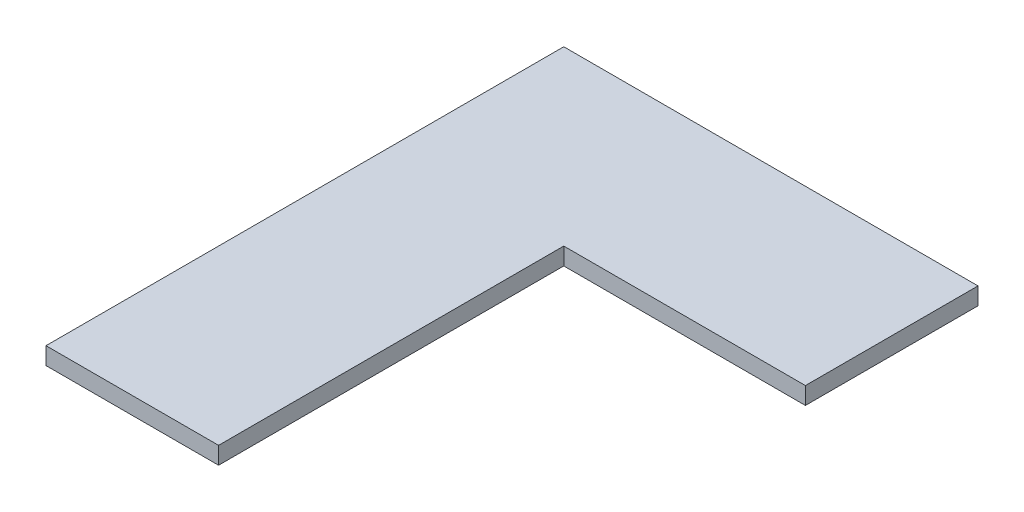
ISO-10303-21;
HEADER;
FILE_DESCRIPTION(('STEP AP214'),'2;1');
FILE_NAME('part.step','',(''),(''),'','','');
FILE_SCHEMA(('AUTOMOTIVE_DESIGN { 1 0 10303 214 1 1 1 1 }'));
ENDSEC;
DATA;
#1=APPLICATION_CONTEXT('core data for automotive mechanical design processes');
#2=APPLICATION_PROTOCOL_DEFINITION('international standard','automotive_design',2000,#1);
#3=PRODUCT_CONTEXT('',#1,'mechanical');
#4=PRODUCT('Part','Part','',(#3));
#5=PRODUCT_RELATED_PRODUCT_CATEGORY('part','',(#4));
#6=PRODUCT_DEFINITION_FORMATION('','',#4);
#7=PRODUCT_DEFINITION_CONTEXT('part definition',#1,'design');
#8=PRODUCT_DEFINITION('design','',#6,#7);
#9=PRODUCT_DEFINITION_SHAPE('','',#8);
#10=(LENGTH_UNIT() NAMED_UNIT(*) SI_UNIT(.MILLI.,.METRE.));
#11=(NAMED_UNIT(*) PLANE_ANGLE_UNIT() SI_UNIT($,.RADIAN.));
#12=(NAMED_UNIT(*) SI_UNIT($,.STERADIAN.) SOLID_ANGLE_UNIT());
#13=UNCERTAINTY_MEASURE_WITH_UNIT(LENGTH_MEASURE(1.E-05),#10,'distance_accuracy_value','');
#14=(GEOMETRIC_REPRESENTATION_CONTEXT(3) GLOBAL_UNCERTAINTY_ASSIGNED_CONTEXT((#13)) GLOBAL_UNIT_ASSIGNED_CONTEXT((#10,
#11,#12)) REPRESENTATION_CONTEXT('',''));
#15=CARTESIAN_POINT('',(0.,0.,0.));
#16=DIRECTION('',(0.,0.,1.));
#17=DIRECTION('',(1.,0.,0.));
#18=AXIS2_PLACEMENT_3D('',#15,#16,#17);
#19=CARTESIAN_POINT('',(0.,1.,0.));
#20=DIRECTION('',(1.,0.,0.));
#21=DIRECTION('',(0.,0.,-1.));
#22=AXIS2_PLACEMENT_3D('',#19,#20,#21);
#23=PLANE('',#22);
#24=DIRECTION('',(0.,0.,1.));
#25=VECTOR('',#24,1.);
#26=CARTESIAN_POINT('',(0.,0.,0.));
#27=LINE('',#26,#25);
#28=CARTESIAN_POINT('',(0.,0.,0.));
#29=VERTEX_POINT('',#28);
#30=CARTESIAN_POINT('',(0.,0.,30.));
#31=VERTEX_POINT('',#30);
#32=EDGE_CURVE('E123',#29,#31,#27,.T.);
#33=ORIENTED_EDGE('',*,*,#32,.T.);
#34=DIRECTION('',(0.,-1.,0.));
#35=VECTOR('',#34,1.);
#36=CARTESIAN_POINT('',(0.,1.,30.));
#37=LINE('',#36,#35);
#38=CARTESIAN_POINT('',(0.,1.,30.));
#39=VERTEX_POINT('',#38);
#40=EDGE_CURVE('E11',#39,#31,#37,.T.);
#41=ORIENTED_EDGE('',*,*,#40,.F.);
#42=DIRECTION('',(0.,0.,1.));
#43=VECTOR('',#42,1.);
#44=CARTESIAN_POINT('',(0.,1.,0.));
#45=LINE('',#44,#43);
#46=CARTESIAN_POINT('',(0.,1.,0.));
#47=VERTEX_POINT('',#46);
#48=EDGE_CURVE('E137',#47,#39,#45,.T.);
#49=ORIENTED_EDGE('',*,*,#48,.F.);
#50=DIRECTION('',(0.,-1.,0.));
#51=VECTOR('',#50,1.);
#52=CARTESIAN_POINT('',(0.,1.,0.));
#53=LINE('',#52,#51);
#54=EDGE_CURVE('E55',#47,#29,#53,.T.);
#55=ORIENTED_EDGE('',*,*,#54,.T.);
#56=EDGE_LOOP('',(#33,#41,#49,#55));
#57=FACE_BOUND('',#56,.T.);
#58=ADVANCED_FACE('F39',(#57),#23,.F.);
#59=CARTESIAN_POINT('',(0.,1.,30.));
#60=DIRECTION('',(0.,0.,-1.));
#61=DIRECTION('',(-1.,0.,0.));
#62=AXIS2_PLACEMENT_3D('',#59,#60,#61);
#63=PLANE('',#62);
#64=DIRECTION('',(1.,0.,0.));
#65=VECTOR('',#64,1.);
#66=CARTESIAN_POINT('',(0.,0.,30.));
#67=LINE('',#66,#65);
#68=CARTESIAN_POINT('',(10.,0.,30.));
#69=VERTEX_POINT('',#68);
#70=EDGE_CURVE('E125',#31,#69,#67,.T.);
#71=ORIENTED_EDGE('',*,*,#70,.T.);
#72=DIRECTION('',(0.,-1.,0.));
#73=VECTOR('',#72,1.);
#74=CARTESIAN_POINT('',(10.,1.,30.));
#75=LINE('',#74,#73);
#76=CARTESIAN_POINT('',(10.,1.,30.));
#77=VERTEX_POINT('',#76);
#78=EDGE_CURVE('E47',#77,#69,#75,.T.);
#79=ORIENTED_EDGE('',*,*,#78,.F.);
#80=DIRECTION('',(1.,0.,0.));
#81=VECTOR('',#80,1.);
#82=CARTESIAN_POINT('',(0.,1.,30.));
#83=LINE('',#82,#81);
#84=EDGE_CURVE('E87',#39,#77,#83,.T.);
#85=ORIENTED_EDGE('',*,*,#84,.F.);
#86=ORIENTED_EDGE('',*,*,#40,.T.);
#87=EDGE_LOOP('',(#71,#79,#85,#86));
#88=FACE_BOUND('',#87,.T.);
#89=ADVANCED_FACE('F143',(#88),#63,.F.);
#90=CARTESIAN_POINT('',(10.,1.,0.));
#91=DIRECTION('',(1.,0.,0.));
#92=DIRECTION('',(0.,0.,-1.));
#93=AXIS2_PLACEMENT_3D('',#90,#91,#92);
#94=PLANE('',#93);
#95=DIRECTION('',(0.,0.,1.));
#96=VECTOR('',#95,1.);
#97=CARTESIAN_POINT('',(10.,0.,0.));
#98=LINE('',#97,#96);
#99=CARTESIAN_POINT('',(10.,0.,10.));
#100=VERTEX_POINT('',#99);
#101=EDGE_CURVE('E128',#100,#69,#98,.T.);
#102=ORIENTED_EDGE('',*,*,#101,.F.);
#103=DIRECTION('',(0.,-1.,0.));
#104=VECTOR('',#103,1.);
#105=CARTESIAN_POINT('',(10.,1.,10.));
#106=LINE('',#105,#104);
#107=CARTESIAN_POINT('',(10.,1.,10.));
#108=VERTEX_POINT('',#107);
#109=EDGE_CURVE('E106',#108,#100,#106,.T.);
#110=ORIENTED_EDGE('',*,*,#109,.F.);
#111=DIRECTION('',(0.,0.,1.));
#112=VECTOR('',#111,1.);
#113=CARTESIAN_POINT('',(10.,1.,0.));
#114=LINE('',#113,#112);
#115=EDGE_CURVE('E115',#108,#77,#114,.T.);
#116=ORIENTED_EDGE('',*,*,#115,.T.);
#117=ORIENTED_EDGE('',*,*,#78,.T.);
#118=EDGE_LOOP('',(#102,#110,#116,#117));
#119=FACE_BOUND('',#118,.T.);
#120=ADVANCED_FACE('F142',(#119),#94,.T.);
#121=CARTESIAN_POINT('',(0.,1.,10.));
#122=DIRECTION('',(0.,0.,1.));
#123=DIRECTION('',(1.,0.,0.));
#124=AXIS2_PLACEMENT_3D('',#121,#122,#123);
#125=PLANE('',#124);
#126=DIRECTION('',(-1.,0.,0.));
#127=VECTOR('',#126,1.);
#128=CARTESIAN_POINT('',(0.,0.,10.));
#129=LINE('',#128,#127);
#130=CARTESIAN_POINT('',(24.,0.,10.));
#131=VERTEX_POINT('',#130);
#132=EDGE_CURVE('E102',#131,#100,#129,.T.);
#133=ORIENTED_EDGE('',*,*,#132,.F.);
#134=DIRECTION('',(0.,-1.,0.));
#135=VECTOR('',#134,1.);
#136=CARTESIAN_POINT('',(24.,1.,10.));
#137=LINE('',#136,#135);
#138=CARTESIAN_POINT('',(24.,1.,10.));
#139=VERTEX_POINT('',#138);
#140=EDGE_CURVE('E97',#139,#131,#137,.T.);
#141=ORIENTED_EDGE('',*,*,#140,.F.);
#142=DIRECTION('',(-1.,0.,0.));
#143=VECTOR('',#142,1.);
#144=CARTESIAN_POINT('',(0.,1.,10.));
#145=LINE('',#144,#143);
#146=EDGE_CURVE('E100',#139,#108,#145,.T.);
#147=ORIENTED_EDGE('',*,*,#146,.T.);
#148=ORIENTED_EDGE('',*,*,#109,.T.);
#149=EDGE_LOOP('',(#133,#141,#147,#148));
#150=FACE_BOUND('',#149,.T.);
#151=ADVANCED_FACE('F99',(#150),#125,.T.);
#152=CARTESIAN_POINT('',(24.,1.,0.));
#153=DIRECTION('',(1.,0.,0.));
#154=DIRECTION('',(0.,0.,-1.));
#155=AXIS2_PLACEMENT_3D('',#152,#153,#154);
#156=PLANE('',#155);
#157=DIRECTION('',(0.,0.,1.));
#158=VECTOR('',#157,1.);
#159=CARTESIAN_POINT('',(24.,0.,0.));
#160=LINE('',#159,#158);
#161=CARTESIAN_POINT('',(24.,0.,0.));
#162=VERTEX_POINT('',#161);
#163=EDGE_CURVE('E132',#162,#131,#160,.T.);
#164=ORIENTED_EDGE('',*,*,#163,.F.);
#165=DIRECTION('',(0.,-1.,0.));
#166=VECTOR('',#165,1.);
#167=CARTESIAN_POINT('',(24.,1.,0.));
#168=LINE('',#167,#166);
#169=CARTESIAN_POINT('',(24.,1.,0.));
#170=VERTEX_POINT('',#169);
#171=EDGE_CURVE('E75',#170,#162,#168,.T.);
#172=ORIENTED_EDGE('',*,*,#171,.F.);
#173=DIRECTION('',(0.,0.,1.));
#174=VECTOR('',#173,1.);
#175=CARTESIAN_POINT('',(24.,1.,0.));
#176=LINE('',#175,#174);
#177=EDGE_CURVE('E113',#170,#139,#176,.T.);
#178=ORIENTED_EDGE('',*,*,#177,.T.);
#179=ORIENTED_EDGE('',*,*,#140,.T.);
#180=EDGE_LOOP('',(#164,#172,#178,#179));
#181=FACE_BOUND('',#180,.T.);
#182=ADVANCED_FACE('F117',(#181),#156,.T.);
#183=CARTESIAN_POINT('',(0.,1.,0.));
#184=DIRECTION('',(0.,0.,-1.));
#185=DIRECTION('',(-1.,0.,0.));
#186=AXIS2_PLACEMENT_3D('',#183,#184,#185);
#187=PLANE('',#186);
#188=DIRECTION('',(1.,0.,0.));
#189=VECTOR('',#188,1.);
#190=CARTESIAN_POINT('',(0.,0.,0.));
#191=LINE('',#190,#189);
#192=EDGE_CURVE('E134',#29,#162,#191,.T.);
#193=ORIENTED_EDGE('',*,*,#192,.F.);
#194=ORIENTED_EDGE('',*,*,#54,.F.);
#195=DIRECTION('',(1.,0.,0.));
#196=VECTOR('',#195,1.);
#197=CARTESIAN_POINT('',(0.,1.,0.));
#198=LINE('',#197,#196);
#199=EDGE_CURVE('E118',#47,#170,#198,.T.);
#200=ORIENTED_EDGE('',*,*,#199,.T.);
#201=ORIENTED_EDGE('',*,*,#171,.T.);
#202=EDGE_LOOP('',(#193,#194,#200,#201));
#203=FACE_BOUND('',#202,.T.);
#204=ADVANCED_FACE('F147',(#203),#187,.T.);
#205=CARTESIAN_POINT('',(0.,1.,0.));
#206=DIRECTION('',(0.,1.,0.));
#207=DIRECTION('',(0.,0.,1.));
#208=AXIS2_PLACEMENT_3D('',#205,#206,#207);
#209=PLANE('',#208);
#210=ORIENTED_EDGE('',*,*,#48,.T.);
#211=ORIENTED_EDGE('',*,*,#84,.T.);
#212=ORIENTED_EDGE('',*,*,#115,.F.);
#213=ORIENTED_EDGE('',*,*,#146,.F.);
#214=ORIENTED_EDGE('',*,*,#177,.F.);
#215=ORIENTED_EDGE('',*,*,#199,.F.);
#216=EDGE_LOOP('',(#210,#211,#212,#213,#214,#215));
#217=FACE_BOUND('',#216,.T.);
#218=ADVANCED_FACE('F111',(#217),#209,.T.);
#219=CARTESIAN_POINT('',(0.,0.,0.));
#220=DIRECTION('',(0.,1.,0.));
#221=DIRECTION('',(0.,0.,1.));
#222=AXIS2_PLACEMENT_3D('',#219,#220,#221);
#223=PLANE('',#222);
#224=ORIENTED_EDGE('',*,*,#32,.F.);
#225=ORIENTED_EDGE('',*,*,#192,.T.);
#226=ORIENTED_EDGE('',*,*,#163,.T.);
#227=ORIENTED_EDGE('',*,*,#132,.T.);
#228=ORIENTED_EDGE('',*,*,#101,.T.);
#229=ORIENTED_EDGE('',*,*,#70,.F.);
#230=EDGE_LOOP('',(#224,#225,#226,#227,#228,#229));
#231=FACE_BOUND('',#230,.T.);
#232=ADVANCED_FACE('F146',(#231),#223,.F.);
#233=CLOSED_SHELL('',(#58,#89,#120,#151,#182,#204,#218,#232));
#234=MANIFOLD_SOLID_BREP('B2',#233);
#235=ADVANCED_BREP_SHAPE_REPRESENTATION('',(#18,#234),#14);
#236=SHAPE_DEFINITION_REPRESENTATION(#9,#235);
ENDSEC;
END-ISO-10303-21;
